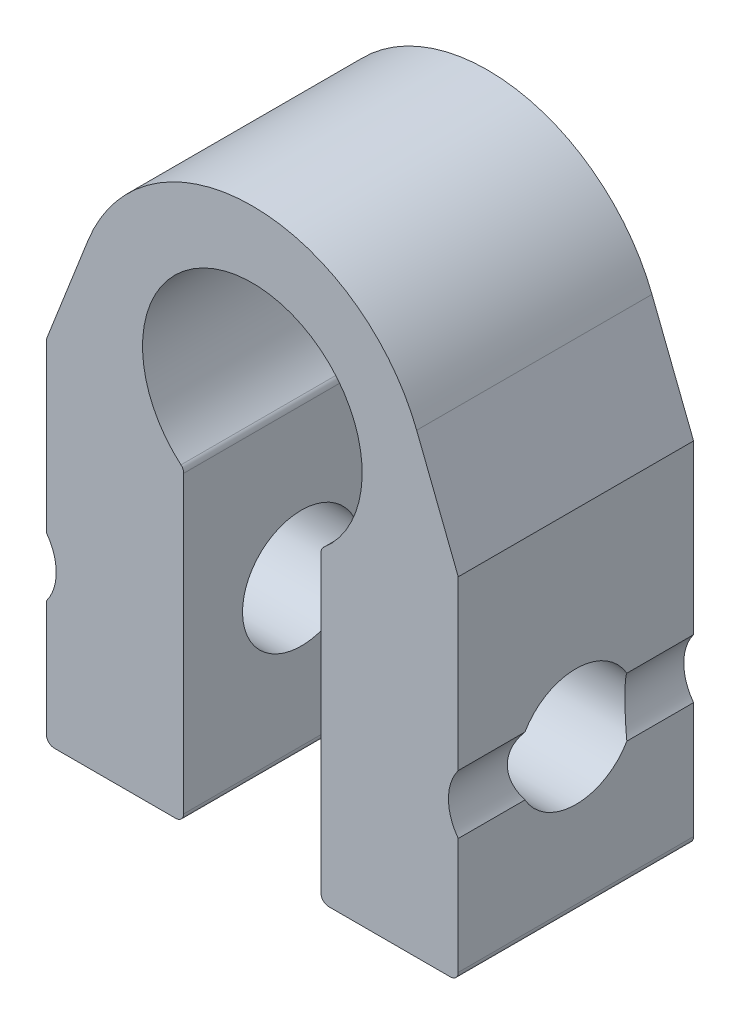
ISO-10303-21;
HEADER;
FILE_DESCRIPTION(('STEP AP214'),'2;1');
FILE_NAME('part.step','',(''),(''),'','','');
FILE_SCHEMA(('AUTOMOTIVE_DESIGN { 1 0 10303 214 1 1 1 1 }'));
ENDSEC;
DATA;
#1=APPLICATION_CONTEXT('core data for automotive mechanical design processes');
#2=APPLICATION_PROTOCOL_DEFINITION('international standard','automotive_design',2000,#1);
#3=PRODUCT_CONTEXT('',#1,'mechanical');
#4=PRODUCT('Part','Part','',(#3));
#5=PRODUCT_RELATED_PRODUCT_CATEGORY('part','',(#4));
#6=PRODUCT_DEFINITION_FORMATION('','',#4);
#7=PRODUCT_DEFINITION_CONTEXT('part definition',#1,'design');
#8=PRODUCT_DEFINITION('design','',#6,#7);
#9=PRODUCT_DEFINITION_SHAPE('','',#8);
#10=(LENGTH_UNIT() NAMED_UNIT(*) SI_UNIT(.MILLI.,.METRE.));
#11=(NAMED_UNIT(*) PLANE_ANGLE_UNIT() SI_UNIT($,.RADIAN.));
#12=(NAMED_UNIT(*) SI_UNIT($,.STERADIAN.) SOLID_ANGLE_UNIT());
#13=UNCERTAINTY_MEASURE_WITH_UNIT(LENGTH_MEASURE(1.E-05),#10,'distance_accuracy_value','');
#14=(GEOMETRIC_REPRESENTATION_CONTEXT(3) GLOBAL_UNCERTAINTY_ASSIGNED_CONTEXT((#13)) GLOBAL_UNIT_ASSIGNED_CONTEXT((#10,
#11,#12)) REPRESENTATION_CONTEXT('',''));
#15=CARTESIAN_POINT('',(0.,0.,0.));
#16=DIRECTION('',(0.,0.,1.));
#17=DIRECTION('',(1.,0.,0.));
#18=AXIS2_PLACEMENT_3D('',#15,#16,#17);
#19=CARTESIAN_POINT('',(6.25,-6.09287464971972,0.));
#20=DIRECTION('',(0.,0.,1.));
#21=DIRECTION('',(1.,0.,0.));
#22=AXIS2_PLACEMENT_3D('',#19,#20,#21);
#23=CYLINDRICAL_SURFACE('',#22,1.25);
#24=DIRECTION('',(0.,0.,1.));
#25=VECTOR('',#24,1.);
#26=CARTESIAN_POINT('',(5.25,-6.84287464971972,0.));
#27=LINE('',#26,#25);
#28=CARTESIAN_POINT('',(5.25,-6.84287464971972,4.29903810567666));
#29=VERTEX_POINT('',#28);
#30=CARTESIAN_POINT('',(5.25,-6.84287464971972,6.));
#31=VERTEX_POINT('',#30);
#32=EDGE_CURVE('E234',#29,#31,#27,.T.);
#33=ORIENTED_EDGE('',*,*,#32,.F.);
#34=CARTESIAN_POINT('',(5.25,-6.84287464971972,4.29903810567666));
#35=CARTESIAN_POINT('',(5.21505773759995,-6.7963270488032,4.32596376002431));
#36=CARTESIAN_POINT('',(5.18284701140209,-6.74655503701543,4.35130751097385));
#37=CARTESIAN_POINT('',(5.12491645200976,-6.64090096453365,4.39749235477212));
#38=CARTESIAN_POINT('',(5.09924962916991,-6.58497395225042,4.41829648962167));
#39=CARTESIAN_POINT('',(5.05589259637046,-6.46774829008866,4.45369899215834));
#40=CARTESIAN_POINT('',(5.03825187196966,-6.4064190260333,4.46825882938237));
#41=CARTESIAN_POINT('',(5.01253392775033,-6.28067840299467,4.48955289888847));
#42=CARTESIAN_POINT('',(5.00441936271169,-6.2162801163893,4.49631768800948));
#43=CARTESIAN_POINT('',(4.99869151482897,-6.09437767690665,4.50109033477879));
#44=CARTESIAN_POINT('',(4.99994812580209,-6.0369605256747,4.50004060489499));
#45=CARTESIAN_POINT('',(5.01024289315279,-5.92328658395379,4.49147218328509));
#46=CARTESIAN_POINT('',(5.01928649731826,-5.86703063406256,4.48394896270121));
#47=CARTESIAN_POINT('',(5.04399700567411,-5.75977467415184,4.4635223484774));
#48=CARTESIAN_POINT('',(5.05935223027445,-5.70865220900674,4.45087248377395));
#49=CARTESIAN_POINT('',(5.09586853244919,-5.60991179883253,4.4210588648522));
#50=CARTESIAN_POINT('',(5.11703262102422,-5.56229568758661,4.4038927698564));
#51=CARTESIAN_POINT('',(5.15677749716897,-5.48576093079707,4.37205772028724));
#52=CARTESIAN_POINT('',(5.1740239048705,-5.45572836888137,4.35834271360069));
#53=CARTESIAN_POINT('',(5.21054102676912,-5.39775425147738,4.32960548334224));
#54=CARTESIAN_POINT('',(5.22980422150886,-5.3698055502234,4.31458814902113));
#55=CARTESIAN_POINT('',(5.25,-5.34287464971972,4.29903810567666));
#56=B_SPLINE_CURVE_WITH_KNOTS('',3,(#34,#35,#36,#37,#38,#39,#40,#41,#42,#43,#44,#45,#46,#47,#48,
#49,#50,#51,#52,#53,#54,#55),.UNSPECIFIED.,.F.,.F.,(4,2,2,2,2,2,2,2,2,2,4),(0.,
0.192524806168671,0.386562911512202,0.581781680161196,0.776232553306624,0.947648909029564,
1.11918528532623,1.28311060063499,1.44712104694823,1.55874051445255,1.66995771337888),.UNSPECIFIED.);
#57=CARTESIAN_POINT('',(5.25,-5.34287464971971,4.29903810567666));
#58=VERTEX_POINT('',#57);
#59=EDGE_CURVE('E340',#29,#58,#56,.T.);
#60=ORIENTED_EDGE('',*,*,#59,.T.);
#61=DIRECTION('',(0.,0.,1.));
#62=VECTOR('',#61,1.);
#63=CARTESIAN_POINT('',(5.25,-5.34287464971972,0.));
#64=LINE('',#63,#62);
#65=CARTESIAN_POINT('',(5.25,-5.34287464971972,6.));
#66=VERTEX_POINT('',#65);
#67=EDGE_CURVE('E242',#58,#66,#64,.T.);
#68=ORIENTED_EDGE('',*,*,#67,.T.);
#69=CARTESIAN_POINT('',(6.25,-6.09287464971972,6.));
#70=DIRECTION('',(0.,0.,1.));
#71=DIRECTION('',(-1.,0.,0.));
#72=AXIS2_PLACEMENT_3D('',#69,#70,#71);
#73=CIRCLE('',#72,1.25);
#74=EDGE_CURVE('E235',#66,#31,#73,.T.);
#75=ORIENTED_EDGE('',*,*,#74,.T.);
#76=EDGE_LOOP('',(#33,#60,#68,#75));
#77=FACE_BOUND('',#76,.T.);
#78=ADVANCED_FACE('F33',(#77),#23,.F.);
#79=CARTESIAN_POINT('',(-6.25,-6.09287464971972,0.));
#80=DIRECTION('',(0.,0.,1.));
#81=DIRECTION('',(1.,0.,0.));
#82=AXIS2_PLACEMENT_3D('',#79,#80,#81);
#83=CYLINDRICAL_SURFACE('',#82,1.25);
#84=DIRECTION('',(0.,0.,1.));
#85=VECTOR('',#84,1.);
#86=CARTESIAN_POINT('',(-5.25,-5.34287464971972,0.));
#87=LINE('',#86,#85);
#88=CARTESIAN_POINT('',(-5.25,-5.34287464971972,4.29903810567666));
#89=VERTEX_POINT('',#88);
#90=CARTESIAN_POINT('',(-5.25,-5.34287464971972,6.));
#91=VERTEX_POINT('',#90);
#92=EDGE_CURVE('E214',#89,#91,#87,.T.);
#93=ORIENTED_EDGE('',*,*,#92,.F.);
#94=CARTESIAN_POINT('',(-5.25,-5.34287464971972,4.29903810567666));
#95=CARTESIAN_POINT('',(-5.21505773759994,-5.38942225063624,4.32596376002431));
#96=CARTESIAN_POINT('',(-5.18284701140209,-5.43919426242401,4.35130751097385));
#97=CARTESIAN_POINT('',(-5.12491645200976,-5.54484833490579,4.39749235477212));
#98=CARTESIAN_POINT('',(-5.09924962916991,-5.60077534718902,4.41829648962167));
#99=CARTESIAN_POINT('',(-5.05589259637046,-5.71800100935078,4.45369899215834));
#100=CARTESIAN_POINT('',(-5.03825187196965,-5.77933027340614,4.46825882938237));
#101=CARTESIAN_POINT('',(-5.01253392775033,-5.90507089644477,4.48955289888847));
#102=CARTESIAN_POINT('',(-5.00441936271169,-5.96946918305013,4.49631768800948));
#103=CARTESIAN_POINT('',(-4.99869151482896,-6.09137162253279,4.50109033477879));
#104=CARTESIAN_POINT('',(-4.99994812580208,-6.14878877376474,4.50004060489498));
#105=CARTESIAN_POINT('',(-5.01024289315279,-6.26246271548565,4.49147218328509));
#106=CARTESIAN_POINT('',(-5.01928649731826,-6.31871866537687,4.48394896270121));
#107=CARTESIAN_POINT('',(-5.04399700567411,-6.4259746252876,4.4635223484774));
#108=CARTESIAN_POINT('',(-5.05935223027445,-6.47709709043269,4.45087248377395));
#109=CARTESIAN_POINT('',(-5.09586853244919,-6.57583750060691,4.4210588648522));
#110=CARTESIAN_POINT('',(-5.11703262102421,-6.62345361185283,4.4038927698564));
#111=CARTESIAN_POINT('',(-5.15677749716897,-6.69998836864237,4.37205772028724));
#112=CARTESIAN_POINT('',(-5.1740239048705,-6.73002093055806,4.35834271360069));
#113=CARTESIAN_POINT('',(-5.21054102676912,-6.78799504796206,4.32960548334224));
#114=CARTESIAN_POINT('',(-5.22980422150886,-6.81594374921604,4.31458814902113));
#115=CARTESIAN_POINT('',(-5.25,-6.84287464971972,4.29903810567666));
#116=B_SPLINE_CURVE_WITH_KNOTS('',3,(#94,#95,#96,#97,#98,#99,#100,#101,#102,#103,#104,#105,#106,
#107,#108,#109,#110,#111,#112,#113,#114,#115),.UNSPECIFIED.,.F.,.F.,(4,2,2,2,2,2,2,2,2,2,4),(0.,
0.192524806168671,0.386562911512202,0.581781680161195,0.776232553306625,0.947648909029565,
1.11918528532623,1.28311060063499,1.44712104694823,1.55874051445255,1.66995771337887),.UNSPECIFIED.);
#117=CARTESIAN_POINT('',(-5.25,-6.84287464971972,4.29903810567666));
#118=VERTEX_POINT('',#117);
#119=EDGE_CURVE('E197',#89,#118,#116,.T.);
#120=ORIENTED_EDGE('',*,*,#119,.T.);
#121=DIRECTION('',(0.,0.,1.));
#122=VECTOR('',#121,1.);
#123=CARTESIAN_POINT('',(-5.25,-6.84287464971972,0.));
#124=LINE('',#123,#122);
#125=CARTESIAN_POINT('',(-5.25,-6.84287464971972,6.));
#126=VERTEX_POINT('',#125);
#127=EDGE_CURVE('E212',#118,#126,#124,.T.);
#128=ORIENTED_EDGE('',*,*,#127,.T.);
#129=CARTESIAN_POINT('',(-6.25,-6.09287464971972,6.));
#130=DIRECTION('',(0.,0.,1.));
#131=DIRECTION('',(1.,0.,0.));
#132=AXIS2_PLACEMENT_3D('',#129,#130,#131);
#133=CIRCLE('',#132,1.25);
#134=EDGE_CURVE('E228',#126,#91,#133,.T.);
#135=ORIENTED_EDGE('',*,*,#134,.T.);
#136=EDGE_LOOP('',(#93,#120,#128,#135));
#137=FACE_BOUND('',#136,.T.);
#138=ADVANCED_FACE('F210',(#137),#83,.F.);
#139=CARTESIAN_POINT('',(5.25,-10.,6.));
#140=DIRECTION('',(-1.,0.,0.));
#141=DIRECTION('',(0.,0.,1.));
#142=AXIS2_PLACEMENT_3D('',#139,#140,#141);
#143=PLANE('',#142);
#144=DIRECTION('',(0.,1.,0.));
#145=VECTOR('',#144,1.);
#146=CARTESIAN_POINT('',(5.25,-10.,6.));
#147=LINE('',#146,#145);
#148=CARTESIAN_POINT('',(5.25,-9.8,6.));
#149=VERTEX_POINT('',#148);
#150=EDGE_CURVE('E253',#149,#31,#147,.T.);
#151=ORIENTED_EDGE('',*,*,#150,.F.);
#152=DIRECTION('',(0.,0.,-1.));
#153=VECTOR('',#152,1.);
#154=CARTESIAN_POINT('',(5.25,-9.8,6.));
#155=LINE('',#154,#153);
#156=CARTESIAN_POINT('',(5.25,-9.8,0.));
#157=VERTEX_POINT('',#156);
#158=EDGE_CURVE('E468',#149,#157,#155,.T.);
#159=ORIENTED_EDGE('',*,*,#158,.T.);
#160=DIRECTION('',(0.,1.,0.));
#161=VECTOR('',#160,1.);
#162=CARTESIAN_POINT('',(5.25,-10.,0.));
#163=LINE('',#162,#161);
#164=CARTESIAN_POINT('',(5.25,-6.84287464971972,0.));
#165=VERTEX_POINT('',#164);
#166=EDGE_CURVE('E279',#157,#165,#163,.T.);
#167=ORIENTED_EDGE('',*,*,#166,.T.);
#168=CARTESIAN_POINT('',(5.25,-6.84287464971972,1.70096189432334));
#169=VERTEX_POINT('',#168);
#170=EDGE_CURVE('E243',#165,#169,#27,.T.);
#171=ORIENTED_EDGE('',*,*,#170,.T.);
#172=CARTESIAN_POINT('',(5.25,-6.09287464971972,3.));
#173=DIRECTION('',(-1.,0.,0.));
#174=DIRECTION('',(0.,-1.,0.));
#175=AXIS2_PLACEMENT_3D('',#172,#173,#174);
#176=CIRCLE('',#175,1.5);
#177=EDGE_CURVE('E437',#169,#29,#176,.T.);
#178=ORIENTED_EDGE('',*,*,#177,.T.);
#179=ORIENTED_EDGE('',*,*,#32,.T.);
#180=EDGE_LOOP('',(#151,#159,#167,#171,#178,#179));
#181=FACE_BOUND('',#180,.T.);
#182=ADVANCED_FACE('F394',(#181),#143,.F.);
#183=CARTESIAN_POINT('',(-5.25,-10.,6.));
#184=DIRECTION('',(-1.,0.,0.));
#185=DIRECTION('',(0.,0.,1.));
#186=AXIS2_PLACEMENT_3D('',#183,#184,#185);
#187=PLANE('',#186);
#188=DIRECTION('',(0.,1.,0.));
#189=VECTOR('',#188,1.);
#190=CARTESIAN_POINT('',(-5.25,-10.,0.));
#191=LINE('',#190,#189);
#192=CARTESIAN_POINT('',(-5.25,-9.8,0.));
#193=VERTEX_POINT('',#192);
#194=CARTESIAN_POINT('',(-5.25,-6.84287464971972,0.));
#195=VERTEX_POINT('',#194);
#196=EDGE_CURVE('E289',#193,#195,#191,.T.);
#197=ORIENTED_EDGE('',*,*,#196,.F.);
#198=DIRECTION('',(0.,0.,-1.));
#199=VECTOR('',#198,1.);
#200=CARTESIAN_POINT('',(-5.25,-9.8,6.));
#201=LINE('',#200,#199);
#202=CARTESIAN_POINT('',(-5.25,-9.8,6.));
#203=VERTEX_POINT('',#202);
#204=EDGE_CURVE('E11',#193,#203,#201,.F.);
#205=ORIENTED_EDGE('',*,*,#204,.T.);
#206=DIRECTION('',(0.,1.,0.));
#207=VECTOR('',#206,1.);
#208=CARTESIAN_POINT('',(-5.25,-10.,6.));
#209=LINE('',#208,#207);
#210=EDGE_CURVE('E220',#203,#126,#209,.T.);
#211=ORIENTED_EDGE('',*,*,#210,.T.);
#212=ORIENTED_EDGE('',*,*,#127,.F.);
#213=CARTESIAN_POINT('',(-5.25,-6.09287464971972,3.));
#214=DIRECTION('',(-1.,0.,0.));
#215=DIRECTION('',(0.,-1.,0.));
#216=AXIS2_PLACEMENT_3D('',#213,#214,#215);
#217=CIRCLE('',#216,1.5);
#218=CARTESIAN_POINT('',(-5.25,-6.84287464971972,1.70096189432334));
#219=VERTEX_POINT('',#218);
#220=EDGE_CURVE('E194',#219,#118,#217,.T.);
#221=ORIENTED_EDGE('',*,*,#220,.F.);
#222=EDGE_CURVE('E221',#195,#219,#124,.T.);
#223=ORIENTED_EDGE('',*,*,#222,.F.);
#224=EDGE_LOOP('',(#197,#205,#211,#212,#221,#223));
#225=FACE_BOUND('',#224,.T.);
#226=ADVANCED_FACE('F218',(#225),#187,.T.);
#227=CARTESIAN_POINT('',(1.75,-2.18574929943944,6.));
#228=DIRECTION('',(1.,0.,0.));
#229=DIRECTION('',(0.,1.,0.));
#230=AXIS2_PLACEMENT_3D('',#227,#228,#229);
#231=PLANE('',#230);
#232=CARTESIAN_POINT('',(1.75,-6.09287464971972,3.));
#233=DIRECTION('',(1.,0.,0.));
#234=DIRECTION('',(0.,1.,0.));
#235=AXIS2_PLACEMENT_3D('',#232,#233,#234);
#236=CIRCLE('',#235,1.5);
#237=CARTESIAN_POINT('',(1.75,-4.59287464971972,3.));
#238=VERTEX_POINT('',#237);
#239=EDGE_CURVE('E238',#238,#238,#236,.T.);
#240=ORIENTED_EDGE('',*,*,#239,.T.);
#241=EDGE_LOOP('',(#240));
#242=FACE_BOUND('',#241,.T.);
#243=DIRECTION('',(0.,-1.,0.));
#244=VECTOR('',#243,1.);
#245=CARTESIAN_POINT('',(1.75,-2.18574929943944,6.));
#246=LINE('',#245,#244);
#247=CARTESIAN_POINT('',(1.75,-2.2798026230356,6.));
#248=VERTEX_POINT('',#247);
#249=CARTESIAN_POINT('',(1.75,-9.8,6.));
#250=VERTEX_POINT('',#249);
#251=EDGE_CURVE('E246',#248,#250,#246,.T.);
#252=ORIENTED_EDGE('',*,*,#251,.F.);
#253=DIRECTION('',(0.,0.,1.));
#254=VECTOR('',#253,1.);
#255=CARTESIAN_POINT('',(1.75,-2.2798026230356,0.));
#256=LINE('',#255,#254);
#257=CARTESIAN_POINT('',(1.75,-2.2798026230356,0.));
#258=VERTEX_POINT('',#257);
#259=EDGE_CURVE('E489',#248,#258,#256,.F.);
#260=ORIENTED_EDGE('',*,*,#259,.T.);
#261=DIRECTION('',(0.,-1.,0.));
#262=VECTOR('',#261,1.);
#263=CARTESIAN_POINT('',(1.75,-2.18574929943944,0.));
#264=LINE('',#263,#262);
#265=CARTESIAN_POINT('',(1.75,-9.8,0.));
#266=VERTEX_POINT('',#265);
#267=EDGE_CURVE('E224',#258,#266,#264,.T.);
#268=ORIENTED_EDGE('',*,*,#267,.T.);
#269=DIRECTION('',(0.,0.,-1.));
#270=VECTOR('',#269,1.);
#271=CARTESIAN_POINT('',(1.75,-9.8,6.));
#272=LINE('',#271,#270);
#273=EDGE_CURVE('E215',#266,#250,#272,.F.);
#274=ORIENTED_EDGE('',*,*,#273,.T.);
#275=EDGE_LOOP('',(#252,#260,#268,#274));
#276=FACE_BOUND('',#275,.T.);
#277=ADVANCED_FACE('F397',(#242,#276),#231,.F.);
#278=CARTESIAN_POINT('',(1.75,-10.,6.));
#279=DIRECTION('',(0.,1.,0.));
#280=DIRECTION('',(0.,0.,1.));
#281=AXIS2_PLACEMENT_3D('',#278,#279,#280);
#282=PLANE('',#281);
#283=DIRECTION('',(1.,0.,0.));
#284=VECTOR('',#283,1.);
#285=CARTESIAN_POINT('',(1.75,-10.,0.));
#286=LINE('',#285,#284);
#287=CARTESIAN_POINT('',(1.95,-10.,0.));
#288=VERTEX_POINT('',#287);
#289=CARTESIAN_POINT('',(5.05,-10.,0.));
#290=VERTEX_POINT('',#289);
#291=EDGE_CURVE('E276',#288,#290,#286,.T.);
#292=ORIENTED_EDGE('',*,*,#291,.T.);
#293=DIRECTION('',(0.,0.,-1.));
#294=VECTOR('',#293,1.);
#295=CARTESIAN_POINT('',(5.05,-10.,6.));
#296=LINE('',#295,#294);
#297=CARTESIAN_POINT('',(5.05,-10.,6.));
#298=VERTEX_POINT('',#297);
#299=EDGE_CURVE('E56',#290,#298,#296,.F.);
#300=ORIENTED_EDGE('',*,*,#299,.T.);
#301=DIRECTION('',(1.,0.,0.));
#302=VECTOR('',#301,1.);
#303=CARTESIAN_POINT('',(1.75,-10.,6.));
#304=LINE('',#303,#302);
#305=CARTESIAN_POINT('',(1.95,-10.,6.));
#306=VERTEX_POINT('',#305);
#307=EDGE_CURVE('E249',#306,#298,#304,.T.);
#308=ORIENTED_EDGE('',*,*,#307,.F.);
#309=DIRECTION('',(0.,0.,-1.));
#310=VECTOR('',#309,1.);
#311=CARTESIAN_POINT('',(1.95,-10.,6.));
#312=LINE('',#311,#310);
#313=EDGE_CURVE('E470',#306,#288,#312,.T.);
#314=ORIENTED_EDGE('',*,*,#313,.T.);
#315=EDGE_LOOP('',(#292,#300,#308,#314));
#316=FACE_BOUND('',#315,.T.);
#317=ADVANCED_FACE('F392',(#316),#282,.F.);
#318=ORIENTED_EDGE('',*,*,#67,.F.);
#319=CARTESIAN_POINT('',(5.25,-5.34287464971971,1.70096189432334));
#320=VERTEX_POINT('',#319);
#321=EDGE_CURVE('E341',#58,#320,#176,.T.);
#322=ORIENTED_EDGE('',*,*,#321,.T.);
#323=CARTESIAN_POINT('',(5.25,-5.34287464971972,0.));
#324=VERTEX_POINT('',#323);
#325=EDGE_CURVE('E239',#324,#320,#64,.T.);
#326=ORIENTED_EDGE('',*,*,#325,.F.);
#327=CARTESIAN_POINT('',(5.25,-1.06478364371522,0.));
#328=VERTEX_POINT('',#327);
#329=EDGE_CURVE('E278',#324,#328,#163,.T.);
#330=ORIENTED_EDGE('',*,*,#329,.T.);
#331=DIRECTION('',(0.,0.,-1.));
#332=VECTOR('',#331,1.);
#333=CARTESIAN_POINT('',(5.25,-1.06478364371522,6.));
#334=LINE('',#333,#332);
#335=CARTESIAN_POINT('',(5.25,-1.06478364371522,6.));
#336=VERTEX_POINT('',#335);
#337=EDGE_CURVE('E307',#336,#328,#334,.T.);
#338=ORIENTED_EDGE('',*,*,#337,.F.);
#339=EDGE_CURVE('E252',#66,#336,#147,.T.);
#340=ORIENTED_EDGE('',*,*,#339,.F.);
#341=EDGE_LOOP('',(#318,#322,#326,#330,#338,#340));
#342=FACE_BOUND('',#341,.T.);
#343=ADVANCED_FACE('F388',(#342),#143,.F.);
#344=CARTESIAN_POINT('',(5.25,-1.06478364371522,6.));
#345=DIRECTION('',(-0.931115030091327,-0.364725651329911,0.));
#346=DIRECTION('',(0.364725651329911,-0.931115030091327,0.));
#347=AXIS2_PLACEMENT_3D('',#344,#345,#346);
#348=PLANE('',#347);
#349=DIRECTION('',(-0.364725651329911,0.931115030091327,0.));
#350=VECTOR('',#349,1.);
#351=CARTESIAN_POINT('',(5.25,-1.06478364371522,0.));
#352=LINE('',#351,#350);
#353=CARTESIAN_POINT('',(4.19001763541097,1.6412654309846,0.));
#354=VERTEX_POINT('',#353);
#355=EDGE_CURVE('E281',#328,#354,#352,.T.);
#356=ORIENTED_EDGE('',*,*,#355,.T.);
#357=DIRECTION('',(0.,0.,-1.));
#358=VECTOR('',#357,1.);
#359=CARTESIAN_POINT('',(4.19001763541097,1.6412654309846,6.));
#360=LINE('',#359,#358);
#361=CARTESIAN_POINT('',(4.19001763541097,1.6412654309846,6.));
#362=VERTEX_POINT('',#361);
#363=EDGE_CURVE('E304',#362,#354,#360,.T.);
#364=ORIENTED_EDGE('',*,*,#363,.F.);
#365=DIRECTION('',(-0.364725651329911,0.931115030091327,0.));
#366=VECTOR('',#365,1.);
#367=CARTESIAN_POINT('',(5.25,-1.06478364371522,6.));
#368=LINE('',#367,#366);
#369=EDGE_CURVE('E255',#336,#362,#368,.T.);
#370=ORIENTED_EDGE('',*,*,#369,.F.);
#371=ORIENTED_EDGE('',*,*,#337,.T.);
#372=EDGE_LOOP('',(#356,#364,#370,#371));
#373=FACE_BOUND('',#372,.T.);
#374=ADVANCED_FACE('F384',(#373),#348,.F.);
#375=CARTESIAN_POINT('',(0.,0.,6.));
#376=DIRECTION('',(0.,0.,-1.));
#377=DIRECTION('',(-1.,0.,0.));
#378=AXIS2_PLACEMENT_3D('',#375,#376,#377);
#379=CYLINDRICAL_SURFACE('',#378,4.5);
#380=CARTESIAN_POINT('',(0.,0.,0.));
#381=DIRECTION('',(0.,0.,1.));
#382=DIRECTION('',(1.,0.,0.));
#383=AXIS2_PLACEMENT_3D('',#380,#381,#382);
#384=CIRCLE('',#383,4.5);
#385=CARTESIAN_POINT('',(-4.19001763541097,1.6412654309846,0.));
#386=VERTEX_POINT('',#385);
#387=EDGE_CURVE('E283',#354,#386,#384,.T.);
#388=ORIENTED_EDGE('',*,*,#387,.T.);
#389=DIRECTION('',(0.,0.,-1.));
#390=VECTOR('',#389,1.);
#391=CARTESIAN_POINT('',(-4.19001763541097,1.6412654309846,6.));
#392=LINE('',#391,#390);
#393=CARTESIAN_POINT('',(-4.19001763541097,1.6412654309846,6.));
#394=VERTEX_POINT('',#393);
#395=EDGE_CURVE('E301',#394,#386,#392,.T.);
#396=ORIENTED_EDGE('',*,*,#395,.F.);
#397=CARTESIAN_POINT('',(0.,0.,6.));
#398=DIRECTION('',(0.,0.,1.));
#399=DIRECTION('',(1.,0.,0.));
#400=AXIS2_PLACEMENT_3D('',#397,#398,#399);
#401=CIRCLE('',#400,4.5);
#402=EDGE_CURVE('E257',#362,#394,#401,.T.);
#403=ORIENTED_EDGE('',*,*,#402,.F.);
#404=ORIENTED_EDGE('',*,*,#363,.T.);
#405=EDGE_LOOP('',(#388,#396,#403,#404));
#406=FACE_BOUND('',#405,.T.);
#407=ADVANCED_FACE('F380',(#406),#379,.T.);
#408=CARTESIAN_POINT('',(-4.19001763541097,1.6412654309846,6.));
#409=DIRECTION('',(0.931115030091327,-0.364725651329911,0.));
#410=DIRECTION('',(0.364725651329911,0.931115030091327,0.));
#411=AXIS2_PLACEMENT_3D('',#408,#409,#410);
#412=PLANE('',#411);
#413=DIRECTION('',(-0.364725651329911,-0.931115030091327,0.));
#414=VECTOR('',#413,1.);
#415=CARTESIAN_POINT('',(-4.19001763541097,1.6412654309846,0.));
#416=LINE('',#415,#414);
#417=CARTESIAN_POINT('',(-5.25,-1.06478364371522,0.));
#418=VERTEX_POINT('',#417);
#419=EDGE_CURVE('E285',#386,#418,#416,.T.);
#420=ORIENTED_EDGE('',*,*,#419,.T.);
#421=DIRECTION('',(0.,0.,-1.));
#422=VECTOR('',#421,1.);
#423=CARTESIAN_POINT('',(-5.25,-1.06478364371522,6.));
#424=LINE('',#423,#422);
#425=CARTESIAN_POINT('',(-5.25,-1.06478364371522,6.));
#426=VERTEX_POINT('',#425);
#427=EDGE_CURVE('E273',#426,#418,#424,.T.);
#428=ORIENTED_EDGE('',*,*,#427,.F.);
#429=DIRECTION('',(-0.364725651329911,-0.931115030091327,0.));
#430=VECTOR('',#429,1.);
#431=CARTESIAN_POINT('',(-4.19001763541097,1.6412654309846,6.));
#432=LINE('',#431,#430);
#433=EDGE_CURVE('E259',#394,#426,#432,.T.);
#434=ORIENTED_EDGE('',*,*,#433,.F.);
#435=ORIENTED_EDGE('',*,*,#395,.T.);
#436=EDGE_LOOP('',(#420,#428,#434,#435));
#437=FACE_BOUND('',#436,.T.);
#438=ADVANCED_FACE('F376',(#437),#412,.F.);
#439=CARTESIAN_POINT('',(-5.25,-5.34287464971972,1.70096189432334));
#440=VERTEX_POINT('',#439);
#441=EDGE_CURVE('E205',#89,#440,#217,.T.);
#442=ORIENTED_EDGE('',*,*,#441,.F.);
#443=ORIENTED_EDGE('',*,*,#92,.T.);
#444=EDGE_CURVE('E262',#91,#426,#209,.T.);
#445=ORIENTED_EDGE('',*,*,#444,.T.);
#446=ORIENTED_EDGE('',*,*,#427,.T.);
#447=CARTESIAN_POINT('',(-5.25,-5.34287464971972,0.));
#448=VERTEX_POINT('',#447);
#449=EDGE_CURVE('E288',#448,#418,#191,.T.);
#450=ORIENTED_EDGE('',*,*,#449,.F.);
#451=EDGE_CURVE('E222',#448,#440,#87,.T.);
#452=ORIENTED_EDGE('',*,*,#451,.T.);
#453=EDGE_LOOP('',(#442,#443,#445,#446,#450,#452));
#454=FACE_BOUND('',#453,.T.);
#455=ADVANCED_FACE('F372',(#454),#187,.T.);
#456=CARTESIAN_POINT('',(-5.25,-10.,6.));
#457=DIRECTION('',(0.,1.,0.));
#458=DIRECTION('',(0.,0.,1.));
#459=AXIS2_PLACEMENT_3D('',#456,#457,#458);
#460=PLANE('',#459);
#461=DIRECTION('',(1.,0.,0.));
#462=VECTOR('',#461,1.);
#463=CARTESIAN_POINT('',(-5.25,-10.,6.));
#464=LINE('',#463,#462);
#465=CARTESIAN_POINT('',(-5.05,-10.,6.));
#466=VERTEX_POINT('',#465);
#467=CARTESIAN_POINT('',(-1.95,-10.,6.));
#468=VERTEX_POINT('',#467);
#469=EDGE_CURVE('E264',#466,#468,#464,.T.);
#470=ORIENTED_EDGE('',*,*,#469,.F.);
#471=DIRECTION('',(0.,0.,-1.));
#472=VECTOR('',#471,1.);
#473=CARTESIAN_POINT('',(-5.05,-10.,0.));
#474=LINE('',#473,#472);
#475=CARTESIAN_POINT('',(-5.05,-10.,0.));
#476=VERTEX_POINT('',#475);
#477=EDGE_CURVE('E41',#466,#476,#474,.T.);
#478=ORIENTED_EDGE('',*,*,#477,.T.);
#479=DIRECTION('',(1.,0.,0.));
#480=VECTOR('',#479,1.);
#481=CARTESIAN_POINT('',(-5.25,-10.,0.));
#482=LINE('',#481,#480);
#483=CARTESIAN_POINT('',(-1.95,-10.,0.));
#484=VERTEX_POINT('',#483);
#485=EDGE_CURVE('E291',#476,#484,#482,.T.);
#486=ORIENTED_EDGE('',*,*,#485,.T.);
#487=DIRECTION('',(0.,0.,-1.));
#488=VECTOR('',#487,1.);
#489=CARTESIAN_POINT('',(-1.95,-10.,6.));
#490=LINE('',#489,#488);
#491=EDGE_CURVE('E479',#484,#468,#490,.F.);
#492=ORIENTED_EDGE('',*,*,#491,.T.);
#493=EDGE_LOOP('',(#470,#478,#486,#492));
#494=FACE_BOUND('',#493,.T.);
#495=ADVANCED_FACE('F368',(#494),#460,.F.);
#496=CARTESIAN_POINT('',(-1.75,-2.18574929943944,6.));
#497=DIRECTION('',(1.,0.,0.));
#498=DIRECTION('',(0.,1.,0.));
#499=AXIS2_PLACEMENT_3D('',#496,#497,#498);
#500=PLANE('',#499);
#501=CARTESIAN_POINT('',(-1.75,-6.09287464971972,3.));
#502=DIRECTION('',(1.,0.,0.));
#503=DIRECTION('',(0.,1.,0.));
#504=AXIS2_PLACEMENT_3D('',#501,#502,#503);
#505=CIRCLE('',#504,1.5);
#506=CARTESIAN_POINT('',(-1.75,-4.59287464971972,3.));
#507=VERTEX_POINT('',#506);
#508=EDGE_CURVE('E451',#507,#507,#505,.T.);
#509=ORIENTED_EDGE('',*,*,#508,.F.);
#510=EDGE_LOOP('',(#509));
#511=FACE_BOUND('',#510,.T.);
#512=DIRECTION('',(0.,-1.,0.));
#513=VECTOR('',#512,1.);
#514=CARTESIAN_POINT('',(-1.75,-2.18574929943944,0.));
#515=LINE('',#514,#513);
#516=CARTESIAN_POINT('',(-1.75,-2.2798026230356,0.));
#517=VERTEX_POINT('',#516);
#518=CARTESIAN_POINT('',(-1.75,-9.8,0.));
#519=VERTEX_POINT('',#518);
#520=EDGE_CURVE('E294',#517,#519,#515,.T.);
#521=ORIENTED_EDGE('',*,*,#520,.F.);
#522=DIRECTION('',(0.,0.,-1.));
#523=VECTOR('',#522,1.);
#524=CARTESIAN_POINT('',(-1.75,-2.2798026230356,6.));
#525=LINE('',#524,#523);
#526=CARTESIAN_POINT('',(-1.75,-2.2798026230356,6.));
#527=VERTEX_POINT('',#526);
#528=EDGE_CURVE('E459',#517,#527,#525,.F.);
#529=ORIENTED_EDGE('',*,*,#528,.T.);
#530=DIRECTION('',(0.,-1.,0.));
#531=VECTOR('',#530,1.);
#532=CARTESIAN_POINT('',(-1.75,-2.18574929943944,6.));
#533=LINE('',#532,#531);
#534=CARTESIAN_POINT('',(-1.75,-9.8,6.));
#535=VERTEX_POINT('',#534);
#536=EDGE_CURVE('E267',#527,#535,#533,.T.);
#537=ORIENTED_EDGE('',*,*,#536,.T.);
#538=DIRECTION('',(0.,0.,-1.));
#539=VECTOR('',#538,1.);
#540=CARTESIAN_POINT('',(-1.75,-9.8,0.));
#541=LINE('',#540,#539);
#542=EDGE_CURVE('E462',#535,#519,#541,.T.);
#543=ORIENTED_EDGE('',*,*,#542,.T.);
#544=EDGE_LOOP('',(#521,#529,#537,#543));
#545=FACE_BOUND('',#544,.T.);
#546=ADVANCED_FACE('F364',(#511,#545),#500,.T.);
#547=CARTESIAN_POINT('',(0.,0.,6.));
#548=DIRECTION('',(0.,0.,-1.));
#549=DIRECTION('',(-1.,0.,0.));
#550=AXIS2_PLACEMENT_3D('',#547,#548,#549);
#551=CYLINDRICAL_SURFACE('',#550,2.8);
#552=CARTESIAN_POINT('',(0.,0.,0.));
#553=DIRECTION('',(0.,0.,1.));
#554=DIRECTION('',(1.,0.,0.));
#555=AXIS2_PLACEMENT_3D('',#552,#553,#554);
#556=CIRCLE('',#555,2.8);
#557=CARTESIAN_POINT('',(1.82,-2.12781578149989,0.));
#558=VERTEX_POINT('',#557);
#559=CARTESIAN_POINT('',(-1.82,-2.12781578149989,0.));
#560=VERTEX_POINT('',#559);
#561=EDGE_CURVE('E250',#558,#560,#556,.T.);
#562=ORIENTED_EDGE('',*,*,#561,.F.);
#563=DIRECTION('',(0.,0.,-1.));
#564=VECTOR('',#563,1.);
#565=CARTESIAN_POINT('',(1.82,-2.12781578149989,6.));
#566=LINE('',#565,#564);
#567=CARTESIAN_POINT('',(1.82,-2.12781578149989,6.));
#568=VERTEX_POINT('',#567);
#569=EDGE_CURVE('E503',#558,#568,#566,.F.);
#570=ORIENTED_EDGE('',*,*,#569,.T.);
#571=CARTESIAN_POINT('',(0.,0.,6.));
#572=DIRECTION('',(0.,0.,1.));
#573=DIRECTION('',(1.,0.,0.));
#574=AXIS2_PLACEMENT_3D('',#571,#572,#573);
#575=CIRCLE('',#574,2.8);
#576=CARTESIAN_POINT('',(-1.82,-2.12781578149989,6.));
#577=VERTEX_POINT('',#576);
#578=EDGE_CURVE('E270',#568,#577,#575,.T.);
#579=ORIENTED_EDGE('',*,*,#578,.T.);
#580=DIRECTION('',(0.,0.,-1.));
#581=VECTOR('',#580,1.);
#582=CARTESIAN_POINT('',(-1.82,-2.12781578149989,6.));
#583=LINE('',#582,#581);
#584=EDGE_CURVE('E501',#577,#560,#583,.T.);
#585=ORIENTED_EDGE('',*,*,#584,.T.);
#586=EDGE_LOOP('',(#562,#570,#579,#585));
#587=FACE_BOUND('',#586,.T.);
#588=ADVANCED_FACE('F358',(#587),#551,.F.);
#589=CARTESIAN_POINT('',(0.,0.,6.));
#590=DIRECTION('',(0.,0.,1.));
#591=DIRECTION('',(1.,0.,0.));
#592=AXIS2_PLACEMENT_3D('',#589,#590,#591);
#593=PLANE('',#592);
#594=ORIENTED_EDGE('',*,*,#578,.F.);
#595=CARTESIAN_POINT('',(1.95,-2.2798026230356,6.));
#596=DIRECTION('',(0.,0.,1.));
#597=DIRECTION('',(1.,0.,0.));
#598=AXIS2_PLACEMENT_3D('',#595,#596,#597);
#599=CIRCLE('',#598,0.2);
#600=EDGE_CURVE('E472',#568,#248,#599,.T.);
#601=ORIENTED_EDGE('',*,*,#600,.T.);
#602=ORIENTED_EDGE('',*,*,#251,.T.);
#603=CARTESIAN_POINT('',(1.95,-9.8,6.));
#604=DIRECTION('',(0.,0.,1.));
#605=DIRECTION('',(1.,0.,0.));
#606=AXIS2_PLACEMENT_3D('',#603,#604,#605);
#607=CIRCLE('',#606,0.2);
#608=EDGE_CURVE('E507',#250,#306,#607,.T.);
#609=ORIENTED_EDGE('',*,*,#608,.T.);
#610=ORIENTED_EDGE('',*,*,#307,.T.);
#611=CARTESIAN_POINT('',(5.05,-9.8,6.));
#612=DIRECTION('',(0.,0.,1.));
#613=DIRECTION('',(1.,0.,0.));
#614=AXIS2_PLACEMENT_3D('',#611,#612,#613);
#615=CIRCLE('',#614,0.2);
#616=EDGE_CURVE('E48',#298,#149,#615,.T.);
#617=ORIENTED_EDGE('',*,*,#616,.T.);
#618=ORIENTED_EDGE('',*,*,#150,.T.);
#619=ORIENTED_EDGE('',*,*,#74,.F.);
#620=ORIENTED_EDGE('',*,*,#339,.T.);
#621=ORIENTED_EDGE('',*,*,#369,.T.);
#622=ORIENTED_EDGE('',*,*,#402,.T.);
#623=ORIENTED_EDGE('',*,*,#433,.T.);
#624=ORIENTED_EDGE('',*,*,#444,.F.);
#625=ORIENTED_EDGE('',*,*,#134,.F.);
#626=ORIENTED_EDGE('',*,*,#210,.F.);
#627=CARTESIAN_POINT('',(-5.05,-9.8,6.));
#628=DIRECTION('',(0.,0.,1.));
#629=DIRECTION('',(1.,0.,0.));
#630=AXIS2_PLACEMENT_3D('',#627,#628,#629);
#631=CIRCLE('',#630,0.2);
#632=EDGE_CURVE('E509',#203,#466,#631,.T.);
#633=ORIENTED_EDGE('',*,*,#632,.T.);
#634=ORIENTED_EDGE('',*,*,#469,.T.);
#635=CARTESIAN_POINT('',(-1.95,-9.8,6.));
#636=DIRECTION('',(0.,0.,1.));
#637=DIRECTION('',(1.,0.,0.));
#638=AXIS2_PLACEMENT_3D('',#635,#636,#637);
#639=CIRCLE('',#638,0.2);
#640=EDGE_CURVE('E505',#468,#535,#639,.T.);
#641=ORIENTED_EDGE('',*,*,#640,.T.);
#642=ORIENTED_EDGE('',*,*,#536,.F.);
#643=CARTESIAN_POINT('',(-1.95,-2.2798026230356,6.));
#644=DIRECTION('',(0.,0.,1.));
#645=DIRECTION('',(1.,0.,0.));
#646=AXIS2_PLACEMENT_3D('',#643,#644,#645);
#647=CIRCLE('',#646,0.2);
#648=EDGE_CURVE('E467',#527,#577,#647,.T.);
#649=ORIENTED_EDGE('',*,*,#648,.T.);
#650=EDGE_LOOP('',(#594,#601,#602,#609,#610,#617,#618,#619,#620,#621,#622,#623,#624,#625,#626,
#633,#634,#641,#642,#649));
#651=FACE_BOUND('',#650,.T.);
#652=ADVANCED_FACE('F354',(#651),#593,.T.);
#653=CARTESIAN_POINT('',(0.,0.,0.));
#654=DIRECTION('',(0.,0.,1.));
#655=DIRECTION('',(1.,0.,0.));
#656=AXIS2_PLACEMENT_3D('',#653,#654,#655);
#657=PLANE('',#656);
#658=ORIENTED_EDGE('',*,*,#267,.F.);
#659=CARTESIAN_POINT('',(1.95,-2.2798026230356,0.));
#660=DIRECTION('',(0.,0.,1.));
#661=DIRECTION('',(1.,0.,0.));
#662=AXIS2_PLACEMENT_3D('',#659,#660,#661);
#663=CIRCLE('',#662,0.2);
#664=EDGE_CURVE('E499',#258,#558,#663,.F.);
#665=ORIENTED_EDGE('',*,*,#664,.T.);
#666=ORIENTED_EDGE('',*,*,#561,.T.);
#667=CARTESIAN_POINT('',(-1.95,-2.2798026230356,0.));
#668=DIRECTION('',(0.,0.,1.));
#669=DIRECTION('',(1.,0.,0.));
#670=AXIS2_PLACEMENT_3D('',#667,#668,#669);
#671=CIRCLE('',#670,0.2);
#672=EDGE_CURVE('E465',#560,#517,#671,.F.);
#673=ORIENTED_EDGE('',*,*,#672,.T.);
#674=ORIENTED_EDGE('',*,*,#520,.T.);
#675=CARTESIAN_POINT('',(-1.95,-9.8,0.));
#676=DIRECTION('',(0.,0.,1.));
#677=DIRECTION('',(1.,0.,0.));
#678=AXIS2_PLACEMENT_3D('',#675,#676,#677);
#679=CIRCLE('',#678,0.2);
#680=EDGE_CURVE('E487',#519,#484,#679,.F.);
#681=ORIENTED_EDGE('',*,*,#680,.T.);
#682=ORIENTED_EDGE('',*,*,#485,.F.);
#683=CARTESIAN_POINT('',(-5.05,-9.8,0.));
#684=DIRECTION('',(0.,0.,1.));
#685=DIRECTION('',(1.,0.,0.));
#686=AXIS2_PLACEMENT_3D('',#683,#684,#685);
#687=CIRCLE('',#686,0.2);
#688=EDGE_CURVE('E486',#476,#193,#687,.F.);
#689=ORIENTED_EDGE('',*,*,#688,.T.);
#690=ORIENTED_EDGE('',*,*,#196,.T.);
#691=CARTESIAN_POINT('',(-6.25,-6.09287464971972,0.));
#692=DIRECTION('',(0.,0.,1.));
#693=DIRECTION('',(1.,0.,0.));
#694=AXIS2_PLACEMENT_3D('',#691,#692,#693);
#695=CIRCLE('',#694,1.25);
#696=EDGE_CURVE('E448',#195,#448,#695,.T.);
#697=ORIENTED_EDGE('',*,*,#696,.T.);
#698=ORIENTED_EDGE('',*,*,#449,.T.);
#699=ORIENTED_EDGE('',*,*,#419,.F.);
#700=ORIENTED_EDGE('',*,*,#387,.F.);
#701=ORIENTED_EDGE('',*,*,#355,.F.);
#702=ORIENTED_EDGE('',*,*,#329,.F.);
#703=CARTESIAN_POINT('',(6.25,-6.09287464971972,0.));
#704=DIRECTION('',(0.,0.,1.));
#705=DIRECTION('',(-1.,0.,0.));
#706=AXIS2_PLACEMENT_3D('',#703,#704,#705);
#707=CIRCLE('',#706,1.25);
#708=EDGE_CURVE('E231',#324,#165,#707,.T.);
#709=ORIENTED_EDGE('',*,*,#708,.T.);
#710=ORIENTED_EDGE('',*,*,#166,.F.);
#711=CARTESIAN_POINT('',(5.05,-9.8,0.));
#712=DIRECTION('',(0.,0.,1.));
#713=DIRECTION('',(1.,0.,0.));
#714=AXIS2_PLACEMENT_3D('',#711,#712,#713);
#715=CIRCLE('',#714,0.2);
#716=EDGE_CURVE('E496',#157,#290,#715,.F.);
#717=ORIENTED_EDGE('',*,*,#716,.T.);
#718=ORIENTED_EDGE('',*,*,#291,.F.);
#719=CARTESIAN_POINT('',(1.95,-9.8,0.));
#720=DIRECTION('',(0.,0.,1.));
#721=DIRECTION('',(1.,0.,0.));
#722=AXIS2_PLACEMENT_3D('',#719,#720,#721);
#723=CIRCLE('',#722,0.2);
#724=EDGE_CURVE('E488',#288,#266,#723,.F.);
#725=ORIENTED_EDGE('',*,*,#724,.T.);
#726=EDGE_LOOP('',(#658,#665,#666,#673,#674,#681,#682,#689,#690,#697,#698,#699,#700,#701,#702,
#709,#710,#717,#718,#725));
#727=FACE_BOUND('',#726,.T.);
#728=ADVANCED_FACE('F352',(#727),#657,.F.);
#729=ORIENTED_EDGE('',*,*,#325,.T.);
#730=CARTESIAN_POINT('',(5.25,-5.34287464971972,1.70096189432334));
#731=CARTESIAN_POINT('',(5.21505773759995,-5.38942225063624,1.67403623997569));
#732=CARTESIAN_POINT('',(5.18284701140209,-5.43919426242401,1.64869248902615));
#733=CARTESIAN_POINT('',(5.12491645200976,-5.54484833490579,1.60250764522787));
#734=CARTESIAN_POINT('',(5.09924962916991,-5.60077534718902,1.58170351037833));
#735=CARTESIAN_POINT('',(5.05589259637046,-5.71800100935077,1.54630100784166));
#736=CARTESIAN_POINT('',(5.03825187196966,-5.77933027340614,1.53174117061763));
#737=CARTESIAN_POINT('',(5.01253392775033,-5.90507089644476,1.51044710111152));
#738=CARTESIAN_POINT('',(5.00441936271169,-5.96946918305013,1.50368231199052));
#739=CARTESIAN_POINT('',(4.99869151482897,-6.09137162253279,1.49890966522121));
#740=CARTESIAN_POINT('',(4.99994812580209,-6.14878877376474,1.49995939510502));
#741=CARTESIAN_POINT('',(5.01024289315279,-6.26246271548564,1.50852781671491));
#742=CARTESIAN_POINT('',(5.01928649731826,-6.31871866537687,1.51605103729879));
#743=CARTESIAN_POINT('',(5.04399700567411,-6.42597462528759,1.5364776515226));
#744=CARTESIAN_POINT('',(5.05935223027445,-6.47709709043269,1.54912751622605));
#745=CARTESIAN_POINT('',(5.09586853244919,-6.57583750060691,1.5789411351478));
#746=CARTESIAN_POINT('',(5.11703262102422,-6.62345361185283,1.5961072301436));
#747=CARTESIAN_POINT('',(5.15677749716897,-6.69998836864237,1.62794227971276));
#748=CARTESIAN_POINT('',(5.1740239048705,-6.73002093055806,1.64165728639931));
#749=CARTESIAN_POINT('',(5.21054102676913,-6.78799504796206,1.67039451665776));
#750=CARTESIAN_POINT('',(5.22980422150887,-6.81594374921604,1.68541185097887));
#751=CARTESIAN_POINT('',(5.25,-6.84287464971972,1.70096189432334));
#752=B_SPLINE_CURVE_WITH_KNOTS('',3,(#730,#731,#732,#733,#734,#735,#736,#737,#738,#739,#740,
#741,#742,#743,#744,#745,#746,#747,#748,#749,#750,#751),.UNSPECIFIED.,.F.,.F.,(4,2,2,2,2,2,2,2,
2,2,4),(0.,0.192524806168672,0.386562911512202,0.581781680161194,0.776232553306624,
0.947648909029564,1.11918528532623,1.28311060063499,1.44712104694823,1.55874051445255,
1.66995771337887),.UNSPECIFIED.);
#753=EDGE_CURVE('E334',#320,#169,#752,.T.);
#754=ORIENTED_EDGE('',*,*,#753,.T.);
#755=ORIENTED_EDGE('',*,*,#170,.F.);
#756=ORIENTED_EDGE('',*,*,#708,.F.);
#757=EDGE_LOOP('',(#729,#754,#755,#756));
#758=FACE_BOUND('',#757,.T.);
#759=ADVANCED_FACE('F348',(#758),#23,.F.);
#760=ORIENTED_EDGE('',*,*,#222,.T.);
#761=CARTESIAN_POINT('',(-5.25,-6.84287464971972,1.70096189432334));
#762=CARTESIAN_POINT('',(-5.21505773759994,-6.7963270488032,1.67403623997569));
#763=CARTESIAN_POINT('',(-5.18284701140209,-6.74655503701543,1.64869248902615));
#764=CARTESIAN_POINT('',(-5.12491645200976,-6.64090096453365,1.60250764522788));
#765=CARTESIAN_POINT('',(-5.09924962916991,-6.58497395225042,1.58170351037833));
#766=CARTESIAN_POINT('',(-5.05589259637046,-6.46774829008866,1.54630100784166));
#767=CARTESIAN_POINT('',(-5.03825187196965,-6.4064190260333,1.53174117061763));
#768=CARTESIAN_POINT('',(-5.01253392775033,-6.28067840299468,1.51044710111152));
#769=CARTESIAN_POINT('',(-5.00441936271169,-6.21628011638931,1.50368231199052));
#770=CARTESIAN_POINT('',(-4.99869151482896,-6.09437767690665,1.49890966522121));
#771=CARTESIAN_POINT('',(-4.99994812580208,-6.0369605256747,1.49995939510502));
#772=CARTESIAN_POINT('',(-5.01024289315279,-5.92328658395379,1.50852781671491));
#773=CARTESIAN_POINT('',(-5.01928649731826,-5.86703063406257,1.51605103729879));
#774=CARTESIAN_POINT('',(-5.04399700567411,-5.75977467415184,1.5364776515226));
#775=CARTESIAN_POINT('',(-5.05935223027445,-5.70865220900675,1.54912751622605));
#776=CARTESIAN_POINT('',(-5.09586853244919,-5.60991179883253,1.5789411351478));
#777=CARTESIAN_POINT('',(-5.11703262102421,-5.56229568758661,1.5961072301436));
#778=CARTESIAN_POINT('',(-5.15677749716897,-5.48576093079707,1.62794227971276));
#779=CARTESIAN_POINT('',(-5.1740239048705,-5.45572836888138,1.64165728639931));
#780=CARTESIAN_POINT('',(-5.21054102676912,-5.39775425147738,1.67039451665776));
#781=CARTESIAN_POINT('',(-5.22980422150886,-5.3698055502234,1.68541185097887));
#782=CARTESIAN_POINT('',(-5.25,-5.34287464971972,1.70096189432334));
#783=B_SPLINE_CURVE_WITH_KNOTS('',3,(#761,#762,#763,#764,#765,#766,#767,#768,#769,#770,#771,
#772,#773,#774,#775,#776,#777,#778,#779,#780,#781,#782),.UNSPECIFIED.,.F.,.F.,(4,2,2,2,2,2,2,2,
2,2,4),(0.,0.192524806168672,0.386562911512203,0.581781680161195,0.776232553306626,
0.947648909029564,1.11918528532623,1.28311060063499,1.44712104694823,1.55874051445255,
1.66995771337888),.UNSPECIFIED.);
#784=EDGE_CURVE('E200',#219,#440,#783,.T.);
#785=ORIENTED_EDGE('',*,*,#784,.T.);
#786=ORIENTED_EDGE('',*,*,#451,.F.);
#787=ORIENTED_EDGE('',*,*,#696,.F.);
#788=EDGE_LOOP('',(#760,#785,#786,#787));
#789=FACE_BOUND('',#788,.T.);
#790=ADVANCED_FACE('F321',(#789),#83,.F.);
#791=CARTESIAN_POINT('',(5.25,-6.09287464971972,3.));
#792=DIRECTION('',(-1.,0.,0.));
#793=DIRECTION('',(0.,-1.,0.));
#794=AXIS2_PLACEMENT_3D('',#791,#792,#793);
#795=CYLINDRICAL_SURFACE('',#794,1.5);
#796=ORIENTED_EDGE('',*,*,#508,.T.);
#797=EDGE_LOOP('',(#796));
#798=FACE_BOUND('',#797,.T.);
#799=ORIENTED_EDGE('',*,*,#441,.T.);
#800=ORIENTED_EDGE('',*,*,#784,.F.);
#801=ORIENTED_EDGE('',*,*,#220,.T.);
#802=ORIENTED_EDGE('',*,*,#119,.F.);
#803=EDGE_LOOP('',(#799,#800,#801,#802));
#804=FACE_BOUND('',#803,.T.);
#805=ADVANCED_FACE('F196',(#798,#804),#795,.F.);
#806=ORIENTED_EDGE('',*,*,#177,.F.);
#807=ORIENTED_EDGE('',*,*,#753,.F.);
#808=ORIENTED_EDGE('',*,*,#321,.F.);
#809=ORIENTED_EDGE('',*,*,#59,.F.);
#810=EDGE_LOOP('',(#806,#807,#808,#809));
#811=FACE_BOUND('',#810,.T.);
#812=ORIENTED_EDGE('',*,*,#239,.F.);
#813=EDGE_LOOP('',(#812));
#814=FACE_BOUND('',#813,.T.);
#815=ADVANCED_FACE('F324',(#811,#814),#795,.F.);
#816=CARTESIAN_POINT('',(1.95,-2.2798026230356,6.));
#817=DIRECTION('',(0.,0.,-1.));
#818=DIRECTION('',(-1.,0.,0.));
#819=AXIS2_PLACEMENT_3D('',#816,#817,#818);
#820=CYLINDRICAL_SURFACE('',#819,0.2);
#821=ORIENTED_EDGE('',*,*,#600,.F.);
#822=ORIENTED_EDGE('',*,*,#569,.F.);
#823=ORIENTED_EDGE('',*,*,#664,.F.);
#824=ORIENTED_EDGE('',*,*,#259,.F.);
#825=EDGE_LOOP('',(#821,#822,#823,#824));
#826=FACE_BOUND('',#825,.T.);
#827=ADVANCED_FACE('F327',(#826),#820,.T.);
#828=CARTESIAN_POINT('',(-1.95,-2.2798026230356,6.));
#829=DIRECTION('',(0.,0.,-1.));
#830=DIRECTION('',(-1.,0.,0.));
#831=AXIS2_PLACEMENT_3D('',#828,#829,#830);
#832=CYLINDRICAL_SURFACE('',#831,0.2);
#833=ORIENTED_EDGE('',*,*,#648,.F.);
#834=ORIENTED_EDGE('',*,*,#528,.F.);
#835=ORIENTED_EDGE('',*,*,#672,.F.);
#836=ORIENTED_EDGE('',*,*,#584,.F.);
#837=EDGE_LOOP('',(#833,#834,#835,#836));
#838=FACE_BOUND('',#837,.T.);
#839=ADVANCED_FACE('F403',(#838),#832,.T.);
#840=CARTESIAN_POINT('',(5.05,-9.8,6.));
#841=DIRECTION('',(0.,0.,-1.));
#842=DIRECTION('',(-1.,0.,0.));
#843=AXIS2_PLACEMENT_3D('',#840,#841,#842);
#844=CYLINDRICAL_SURFACE('',#843,0.2);
#845=ORIENTED_EDGE('',*,*,#616,.F.);
#846=ORIENTED_EDGE('',*,*,#299,.F.);
#847=ORIENTED_EDGE('',*,*,#716,.F.);
#848=ORIENTED_EDGE('',*,*,#158,.F.);
#849=EDGE_LOOP('',(#845,#846,#847,#848));
#850=FACE_BOUND('',#849,.T.);
#851=ADVANCED_FACE('F407',(#850),#844,.T.);
#852=CARTESIAN_POINT('',(-5.05,-9.8,6.));
#853=DIRECTION('',(0.,0.,1.));
#854=DIRECTION('',(1.,0.,0.));
#855=AXIS2_PLACEMENT_3D('',#852,#853,#854);
#856=CYLINDRICAL_SURFACE('',#855,0.2);
#857=ORIENTED_EDGE('',*,*,#632,.F.);
#858=ORIENTED_EDGE('',*,*,#204,.F.);
#859=ORIENTED_EDGE('',*,*,#688,.F.);
#860=ORIENTED_EDGE('',*,*,#477,.F.);
#861=EDGE_LOOP('',(#857,#858,#859,#860));
#862=FACE_BOUND('',#861,.T.);
#863=ADVANCED_FACE('F411',(#862),#856,.T.);
#864=CARTESIAN_POINT('',(1.95,-9.8,6.));
#865=DIRECTION('',(0.,0.,-1.));
#866=DIRECTION('',(-1.,0.,0.));
#867=AXIS2_PLACEMENT_3D('',#864,#865,#866);
#868=CYLINDRICAL_SURFACE('',#867,0.2);
#869=ORIENTED_EDGE('',*,*,#608,.F.);
#870=ORIENTED_EDGE('',*,*,#273,.F.);
#871=ORIENTED_EDGE('',*,*,#724,.F.);
#872=ORIENTED_EDGE('',*,*,#313,.F.);
#873=EDGE_LOOP('',(#869,#870,#871,#872));
#874=FACE_BOUND('',#873,.T.);
#875=ADVANCED_FACE('F414',(#874),#868,.T.);
#876=CARTESIAN_POINT('',(-1.95,-9.8,6.));
#877=DIRECTION('',(0.,0.,1.));
#878=DIRECTION('',(1.,0.,0.));
#879=AXIS2_PLACEMENT_3D('',#876,#877,#878);
#880=CYLINDRICAL_SURFACE('',#879,0.2);
#881=ORIENTED_EDGE('',*,*,#640,.F.);
#882=ORIENTED_EDGE('',*,*,#491,.F.);
#883=ORIENTED_EDGE('',*,*,#680,.F.);
#884=ORIENTED_EDGE('',*,*,#542,.F.);
#885=EDGE_LOOP('',(#881,#882,#883,#884));
#886=FACE_BOUND('',#885,.T.);
#887=ADVANCED_FACE('F35',(#886),#880,.T.);
#888=CLOSED_SHELL('',(#78,#138,#182,#226,#277,#317,#343,#374,#407,#438,#455,#495,#546,#588,#652,
#728,#759,#790,#805,#815,#827,#839,#851,#863,#875,#887));
#889=MANIFOLD_SOLID_BREP('B2',#888);
#890=ADVANCED_BREP_SHAPE_REPRESENTATION('',(#18,#889),#14);
#891=SHAPE_DEFINITION_REPRESENTATION(#9,#890);
ENDSEC;
END-ISO-10303-21;
